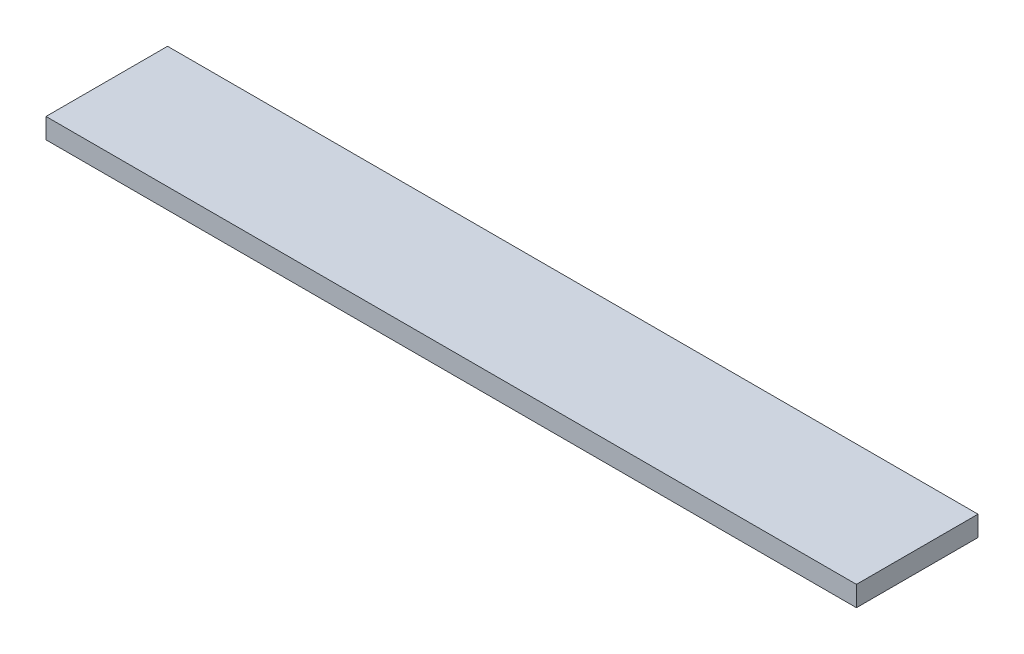
ISO-10303-21;
HEADER;
FILE_DESCRIPTION(('STEP AP214'),'2;1');
FILE_NAME('part.step','',(''),(''),'','','');
FILE_SCHEMA(('AUTOMOTIVE_DESIGN { 1 0 10303 214 1 1 1 1 }'));
ENDSEC;
DATA;
#1=APPLICATION_CONTEXT('core data for automotive mechanical design processes');
#2=APPLICATION_PROTOCOL_DEFINITION('international standard','automotive_design',2000,#1);
#3=PRODUCT_CONTEXT('',#1,'mechanical');
#4=PRODUCT('Part','Part','',(#3));
#5=PRODUCT_RELATED_PRODUCT_CATEGORY('part','',(#4));
#6=PRODUCT_DEFINITION_FORMATION('','',#4);
#7=PRODUCT_DEFINITION_CONTEXT('part definition',#1,'design');
#8=PRODUCT_DEFINITION('design','',#6,#7);
#9=PRODUCT_DEFINITION_SHAPE('','',#8);
#10=(LENGTH_UNIT() NAMED_UNIT(*) SI_UNIT(.MILLI.,.METRE.));
#11=(NAMED_UNIT(*) PLANE_ANGLE_UNIT() SI_UNIT($,.RADIAN.));
#12=(NAMED_UNIT(*) SI_UNIT($,.STERADIAN.) SOLID_ANGLE_UNIT());
#13=UNCERTAINTY_MEASURE_WITH_UNIT(LENGTH_MEASURE(1.E-05),#10,'distance_accuracy_value','');
#14=(GEOMETRIC_REPRESENTATION_CONTEXT(3) GLOBAL_UNCERTAINTY_ASSIGNED_CONTEXT((#13)) GLOBAL_UNIT_ASSIGNED_CONTEXT((#10,
#11,#12)) REPRESENTATION_CONTEXT('',''));
#15=CARTESIAN_POINT('',(0.,0.,0.));
#16=DIRECTION('',(0.,0.,1.));
#17=DIRECTION('',(1.,0.,0.));
#18=AXIS2_PLACEMENT_3D('',#15,#16,#17);
#19=CARTESIAN_POINT('',(40.,2.,6.));
#20=DIRECTION('',(-1.,0.,0.));
#21=DIRECTION('',(0.,0.,1.));
#22=AXIS2_PLACEMENT_3D('',#19,#20,#21);
#23=PLANE('',#22);
#24=DIRECTION('',(0.,0.,-1.));
#25=VECTOR('',#24,1.);
#26=CARTESIAN_POINT('',(40.,0.,6.));
#27=LINE('',#26,#25);
#28=CARTESIAN_POINT('',(40.,0.,6.));
#29=VERTEX_POINT('',#28);
#30=CARTESIAN_POINT('',(40.,0.,-6.));
#31=VERTEX_POINT('',#30);
#32=EDGE_CURVE('E96',#29,#31,#27,.T.);
#33=ORIENTED_EDGE('',*,*,#32,.T.);
#34=DIRECTION('',(0.,-1.,0.));
#35=VECTOR('',#34,1.);
#36=CARTESIAN_POINT('',(40.,2.,-6.));
#37=LINE('',#36,#35);
#38=CARTESIAN_POINT('',(40.,2.,-6.));
#39=VERTEX_POINT('',#38);
#40=EDGE_CURVE('E11',#39,#31,#37,.T.);
#41=ORIENTED_EDGE('',*,*,#40,.F.);
#42=DIRECTION('',(0.,0.,-1.));
#43=VECTOR('',#42,1.);
#44=CARTESIAN_POINT('',(40.,2.,6.));
#45=LINE('',#44,#43);
#46=CARTESIAN_POINT('',(40.,2.,6.));
#47=VERTEX_POINT('',#46);
#48=EDGE_CURVE('E84',#47,#39,#45,.T.);
#49=ORIENTED_EDGE('',*,*,#48,.F.);
#50=DIRECTION('',(0.,-1.,0.));
#51=VECTOR('',#50,1.);
#52=CARTESIAN_POINT('',(40.,2.,6.));
#53=LINE('',#52,#51);
#54=EDGE_CURVE('E92',#47,#29,#53,.T.);
#55=ORIENTED_EDGE('',*,*,#54,.T.);
#56=EDGE_LOOP('',(#33,#41,#49,#55));
#57=FACE_BOUND('',#56,.T.);
#58=ADVANCED_FACE('F33',(#57),#23,.F.);
#59=CARTESIAN_POINT('',(-40.,2.,-6.));
#60=DIRECTION('',(0.,0.,1.));
#61=DIRECTION('',(1.,0.,0.));
#62=AXIS2_PLACEMENT_3D('',#59,#60,#61);
#63=PLANE('',#62);
#64=DIRECTION('',(-1.,0.,0.));
#65=VECTOR('',#64,1.);
#66=CARTESIAN_POINT('',(-40.,0.,-6.));
#67=LINE('',#66,#65);
#68=CARTESIAN_POINT('',(-40.,0.,-6.));
#69=VERTEX_POINT('',#68);
#70=EDGE_CURVE('E88',#31,#69,#67,.T.);
#71=ORIENTED_EDGE('',*,*,#70,.T.);
#72=DIRECTION('',(0.,-1.,0.));
#73=VECTOR('',#72,1.);
#74=CARTESIAN_POINT('',(-40.,2.,-6.));
#75=LINE('',#74,#73);
#76=CARTESIAN_POINT('',(-40.,2.,-6.));
#77=VERTEX_POINT('',#76);
#78=EDGE_CURVE('E41',#77,#69,#75,.T.);
#79=ORIENTED_EDGE('',*,*,#78,.F.);
#80=DIRECTION('',(-1.,0.,0.));
#81=VECTOR('',#80,1.);
#82=CARTESIAN_POINT('',(-40.,2.,-6.));
#83=LINE('',#82,#81);
#84=EDGE_CURVE('E79',#39,#77,#83,.T.);
#85=ORIENTED_EDGE('',*,*,#84,.F.);
#86=ORIENTED_EDGE('',*,*,#40,.T.);
#87=EDGE_LOOP('',(#71,#79,#85,#86));
#88=FACE_BOUND('',#87,.T.);
#89=ADVANCED_FACE('F87',(#88),#63,.F.);
#90=CARTESIAN_POINT('',(-40.,2.,6.));
#91=DIRECTION('',(1.,0.,0.));
#92=DIRECTION('',(0.,0.,-1.));
#93=AXIS2_PLACEMENT_3D('',#90,#91,#92);
#94=PLANE('',#93);
#95=DIRECTION('',(0.,0.,1.));
#96=VECTOR('',#95,1.);
#97=CARTESIAN_POINT('',(-40.,0.,6.));
#98=LINE('',#97,#96);
#99=CARTESIAN_POINT('',(-40.,0.,6.));
#100=VERTEX_POINT('',#99);
#101=EDGE_CURVE('E66',#69,#100,#98,.T.);
#102=ORIENTED_EDGE('',*,*,#101,.T.);
#103=DIRECTION('',(0.,-1.,0.));
#104=VECTOR('',#103,1.);
#105=CARTESIAN_POINT('',(-40.,2.,6.));
#106=LINE('',#105,#104);
#107=CARTESIAN_POINT('',(-40.,2.,6.));
#108=VERTEX_POINT('',#107);
#109=EDGE_CURVE('E89',#108,#100,#106,.T.);
#110=ORIENTED_EDGE('',*,*,#109,.F.);
#111=DIRECTION('',(0.,0.,1.));
#112=VECTOR('',#111,1.);
#113=CARTESIAN_POINT('',(-40.,2.,6.));
#114=LINE('',#113,#112);
#115=EDGE_CURVE('E82',#77,#108,#114,.T.);
#116=ORIENTED_EDGE('',*,*,#115,.F.);
#117=ORIENTED_EDGE('',*,*,#78,.T.);
#118=EDGE_LOOP('',(#102,#110,#116,#117));
#119=FACE_BOUND('',#118,.T.);
#120=ADVANCED_FACE('F90',(#119),#94,.F.);
#121=CARTESIAN_POINT('',(-40.,2.,6.));
#122=DIRECTION('',(0.,0.,-1.));
#123=DIRECTION('',(-1.,0.,0.));
#124=AXIS2_PLACEMENT_3D('',#121,#122,#123);
#125=PLANE('',#124);
#126=DIRECTION('',(1.,0.,0.));
#127=VECTOR('',#126,1.);
#128=CARTESIAN_POINT('',(-40.,0.,6.));
#129=LINE('',#128,#127);
#130=EDGE_CURVE('E72',#100,#29,#129,.T.);
#131=ORIENTED_EDGE('',*,*,#130,.T.);
#132=ORIENTED_EDGE('',*,*,#54,.F.);
#133=DIRECTION('',(1.,0.,0.));
#134=VECTOR('',#133,1.);
#135=CARTESIAN_POINT('',(-40.,2.,6.));
#136=LINE('',#135,#134);
#137=EDGE_CURVE('E49',#108,#47,#136,.T.);
#138=ORIENTED_EDGE('',*,*,#137,.F.);
#139=ORIENTED_EDGE('',*,*,#109,.T.);
#140=EDGE_LOOP('',(#131,#132,#138,#139));
#141=FACE_BOUND('',#140,.T.);
#142=ADVANCED_FACE('F103',(#141),#125,.F.);
#143=CARTESIAN_POINT('',(0.,2.,0.));
#144=DIRECTION('',(0.,-1.,0.));
#145=DIRECTION('',(0.,0.,-1.));
#146=AXIS2_PLACEMENT_3D('',#143,#144,#145);
#147=PLANE('',#146);
#148=ORIENTED_EDGE('',*,*,#48,.T.);
#149=ORIENTED_EDGE('',*,*,#84,.T.);
#150=ORIENTED_EDGE('',*,*,#115,.T.);
#151=ORIENTED_EDGE('',*,*,#137,.T.);
#152=EDGE_LOOP('',(#148,#149,#150,#151));
#153=FACE_BOUND('',#152,.T.);
#154=ADVANCED_FACE('F80',(#153),#147,.F.);
#155=CARTESIAN_POINT('',(0.,0.,0.));
#156=DIRECTION('',(0.,-1.,0.));
#157=DIRECTION('',(0.,0.,-1.));
#158=AXIS2_PLACEMENT_3D('',#155,#156,#157);
#159=PLANE('',#158);
#160=ORIENTED_EDGE('',*,*,#32,.F.);
#161=ORIENTED_EDGE('',*,*,#130,.F.);
#162=ORIENTED_EDGE('',*,*,#101,.F.);
#163=ORIENTED_EDGE('',*,*,#70,.F.);
#164=EDGE_LOOP('',(#160,#161,#162,#163));
#165=FACE_BOUND('',#164,.T.);
#166=ADVANCED_FACE('F106',(#165),#159,.T.);
#167=CLOSED_SHELL('',(#58,#89,#120,#142,#154,#166));
#168=MANIFOLD_SOLID_BREP('B2',#167);
#169=ADVANCED_BREP_SHAPE_REPRESENTATION('',(#18,#168),#14);
#170=SHAPE_DEFINITION_REPRESENTATION(#9,#169);
ENDSEC;
END-ISO-10303-21;
